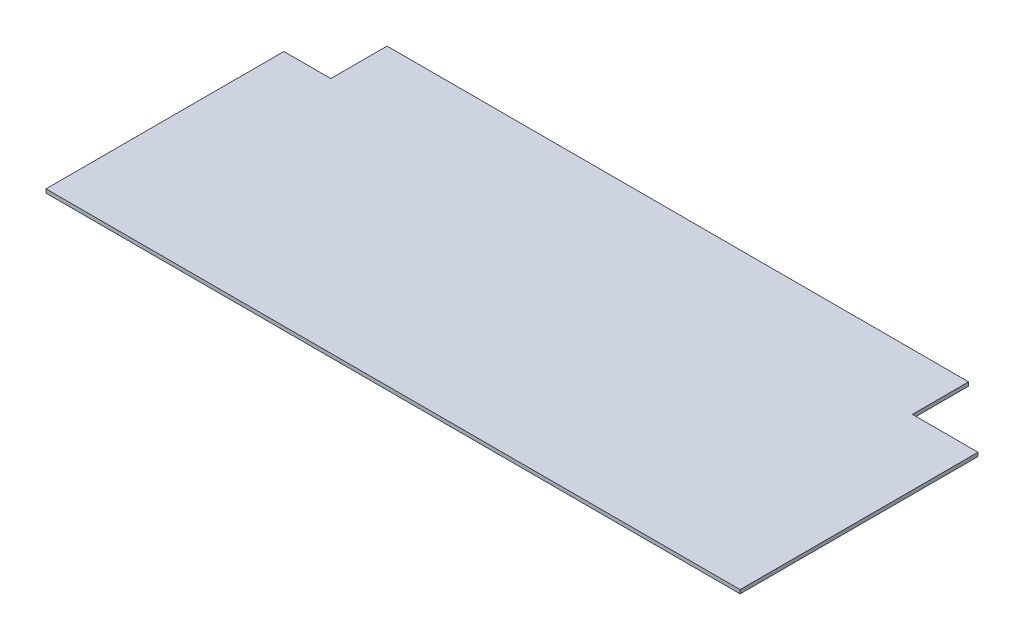
ISO-10303-21;
HEADER;
FILE_DESCRIPTION(('STEP AP214'),'2;1');
FILE_NAME('part.step','',(''),(''),'','','');
FILE_SCHEMA(('AUTOMOTIVE_DESIGN { 1 0 10303 214 1 1 1 1 }'));
ENDSEC;
DATA;
#1=APPLICATION_CONTEXT('core data for automotive mechanical design processes');
#2=APPLICATION_PROTOCOL_DEFINITION('international standard','automotive_design',2000,#1);
#3=PRODUCT_CONTEXT('',#1,'mechanical');
#4=PRODUCT('Part','Part','',(#3));
#5=PRODUCT_RELATED_PRODUCT_CATEGORY('part','',(#4));
#6=PRODUCT_DEFINITION_FORMATION('','',#4);
#7=PRODUCT_DEFINITION_CONTEXT('part definition',#1,'design');
#8=PRODUCT_DEFINITION('design','',#6,#7);
#9=PRODUCT_DEFINITION_SHAPE('','',#8);
#10=(LENGTH_UNIT() NAMED_UNIT(*) SI_UNIT(.MILLI.,.METRE.));
#11=(NAMED_UNIT(*) PLANE_ANGLE_UNIT() SI_UNIT($,.RADIAN.));
#12=(NAMED_UNIT(*) SI_UNIT($,.STERADIAN.) SOLID_ANGLE_UNIT());
#13=UNCERTAINTY_MEASURE_WITH_UNIT(LENGTH_MEASURE(1.E-05),#10,'distance_accuracy_value','');
#14=(GEOMETRIC_REPRESENTATION_CONTEXT(3) GLOBAL_UNCERTAINTY_ASSIGNED_CONTEXT((#13)) GLOBAL_UNIT_ASSIGNED_CONTEXT((#10,
#11,#12)) REPRESENTATION_CONTEXT('',''));
#15=CARTESIAN_POINT('',(0.,0.,0.));
#16=DIRECTION('',(0.,0.,1.));
#17=DIRECTION('',(1.,0.,0.));
#18=AXIS2_PLACEMENT_3D('',#15,#16,#17);
#19=CARTESIAN_POINT('',(301.178602807518,2.54,0.));
#20=DIRECTION('',(1.,0.,0.));
#21=DIRECTION('',(0.,0.,-1.));
#22=AXIS2_PLACEMENT_3D('',#19,#20,#21);
#23=PLANE('',#22);
#24=DIRECTION('',(0.,0.,1.));
#25=VECTOR('',#24,1.);
#26=CARTESIAN_POINT('',(301.178602807518,0.,0.));
#27=LINE('',#26,#25);
#28=CARTESIAN_POINT('',(301.178602807518,0.,-166.257824305169));
#29=VERTEX_POINT('',#28);
#30=CARTESIAN_POINT('',(301.178602807518,0.,-128.157824305169));
#31=VERTEX_POINT('',#30);
#32=EDGE_CURVE('E133',#29,#31,#27,.T.);
#33=ORIENTED_EDGE('',*,*,#32,.F.);
#34=DIRECTION('',(0.,-1.,0.));
#35=VECTOR('',#34,1.);
#36=CARTESIAN_POINT('',(301.178602807518,2.54,-166.257824305169));
#37=LINE('',#36,#35);
#38=CARTESIAN_POINT('',(301.178602807518,2.54,-166.257824305169));
#39=VERTEX_POINT('',#38);
#40=EDGE_CURVE('E11',#39,#29,#37,.T.);
#41=ORIENTED_EDGE('',*,*,#40,.F.);
#42=DIRECTION('',(0.,0.,1.));
#43=VECTOR('',#42,1.);
#44=CARTESIAN_POINT('',(301.178602807518,2.54,0.));
#45=LINE('',#44,#43);
#46=CARTESIAN_POINT('',(301.178602807518,2.54,-128.157824305169));
#47=VERTEX_POINT('',#46);
#48=EDGE_CURVE('E152',#39,#47,#45,.T.);
#49=ORIENTED_EDGE('',*,*,#48,.T.);
#50=DIRECTION('',(0.,-1.,0.));
#51=VECTOR('',#50,1.);
#52=CARTESIAN_POINT('',(301.178602807518,2.54,-128.157824305169));
#53=LINE('',#52,#51);
#54=EDGE_CURVE('E92',#47,#31,#53,.T.);
#55=ORIENTED_EDGE('',*,*,#54,.T.);
#56=EDGE_LOOP('',(#33,#41,#49,#55));
#57=FACE_BOUND('',#56,.T.);
#58=ADVANCED_FACE('F41',(#57),#23,.T.);
#59=CARTESIAN_POINT('',(0.,2.54,-166.257824305169));
#60=DIRECTION('',(0.,0.,-1.));
#61=DIRECTION('',(-1.,0.,0.));
#62=AXIS2_PLACEMENT_3D('',#59,#60,#61);
#63=PLANE('',#62);
#64=DIRECTION('',(1.,0.,0.));
#65=VECTOR('',#64,1.);
#66=CARTESIAN_POINT('',(0.,0.,-166.257824305169));
#67=LINE('',#66,#65);
#68=CARTESIAN_POINT('',(-92.5227972404832,0.,-166.257824305169));
#69=VERTEX_POINT('',#68);
#70=EDGE_CURVE('E136',#69,#29,#67,.T.);
#71=ORIENTED_EDGE('',*,*,#70,.F.);
#72=DIRECTION('',(0.,-1.,0.));
#73=VECTOR('',#72,1.);
#74=CARTESIAN_POINT('',(-92.5227972404832,2.54,-166.257824305169));
#75=LINE('',#74,#73);
#76=CARTESIAN_POINT('',(-92.5227972404832,2.54,-166.257824305169));
#77=VERTEX_POINT('',#76);
#78=EDGE_CURVE('E49',#77,#69,#75,.T.);
#79=ORIENTED_EDGE('',*,*,#78,.F.);
#80=DIRECTION('',(1.,0.,0.));
#81=VECTOR('',#80,1.);
#82=CARTESIAN_POINT('',(0.,2.54,-166.257824305169));
#83=LINE('',#82,#81);
#84=EDGE_CURVE('E173',#77,#39,#83,.T.);
#85=ORIENTED_EDGE('',*,*,#84,.T.);
#86=ORIENTED_EDGE('',*,*,#40,.T.);
#87=EDGE_LOOP('',(#71,#79,#85,#86));
#88=FACE_BOUND('',#87,.T.);
#89=ADVANCED_FACE('F172',(#88),#63,.T.);
#90=CARTESIAN_POINT('',(-92.5227972404832,2.54,0.));
#91=DIRECTION('',(1.,0.,0.));
#92=DIRECTION('',(0.,0.,-1.));
#93=AXIS2_PLACEMENT_3D('',#90,#91,#92);
#94=PLANE('',#93);
#95=DIRECTION('',(0.,0.,1.));
#96=VECTOR('',#95,1.);
#97=CARTESIAN_POINT('',(-92.5227972404832,0.,0.));
#98=LINE('',#97,#96);
#99=CARTESIAN_POINT('',(-92.5227972404832,0.,-128.157824305169));
#100=VERTEX_POINT('',#99);
#101=EDGE_CURVE('E139',#69,#100,#98,.T.);
#102=ORIENTED_EDGE('',*,*,#101,.T.);
#103=DIRECTION('',(0.,-1.,0.));
#104=VECTOR('',#103,1.);
#105=CARTESIAN_POINT('',(-92.5227972404832,2.54,-128.157824305169));
#106=LINE('',#105,#104);
#107=CARTESIAN_POINT('',(-92.5227972404832,2.54,-128.157824305169));
#108=VERTEX_POINT('',#107);
#109=EDGE_CURVE('E158',#108,#100,#106,.T.);
#110=ORIENTED_EDGE('',*,*,#109,.F.);
#111=DIRECTION('',(0.,0.,1.));
#112=VECTOR('',#111,1.);
#113=CARTESIAN_POINT('',(-92.5227972404832,2.54,0.));
#114=LINE('',#113,#112);
#115=EDGE_CURVE('E164',#77,#108,#114,.T.);
#116=ORIENTED_EDGE('',*,*,#115,.F.);
#117=ORIENTED_EDGE('',*,*,#78,.T.);
#118=EDGE_LOOP('',(#102,#110,#116,#117));
#119=FACE_BOUND('',#118,.T.);
#120=ADVANCED_FACE('F162',(#119),#94,.F.);
#121=CARTESIAN_POINT('',(-1.12034462464145E-13,2.54,-128.157824305169));
#122=DIRECTION('',(0.,0.,-1.));
#123=DIRECTION('',(-1.,0.,0.));
#124=AXIS2_PLACEMENT_3D('',#121,#122,#123);
#125=PLANE('',#124);
#126=DIRECTION('',(1.,0.,0.));
#127=VECTOR('',#126,1.);
#128=CARTESIAN_POINT('',(-1.12034462464145E-13,0.,-128.157824305169));
#129=LINE('',#128,#127);
#130=CARTESIAN_POINT('',(-124.272797240483,0.,-128.157824305169));
#131=VERTEX_POINT('',#130);
#132=EDGE_CURVE('E142',#131,#100,#129,.T.);
#133=ORIENTED_EDGE('',*,*,#132,.F.);
#134=DIRECTION('',(0.,-1.,0.));
#135=VECTOR('',#134,1.);
#136=CARTESIAN_POINT('',(-124.272797240483,2.54,-128.157824305169));
#137=LINE('',#136,#135);
#138=CARTESIAN_POINT('',(-124.272797240483,2.54,-128.157824305169));
#139=VERTEX_POINT('',#138);
#140=EDGE_CURVE('E156',#139,#131,#137,.T.);
#141=ORIENTED_EDGE('',*,*,#140,.F.);
#142=DIRECTION('',(1.,0.,0.));
#143=VECTOR('',#142,1.);
#144=CARTESIAN_POINT('',(-1.12034462464145E-13,2.54,-128.157824305169));
#145=LINE('',#144,#143);
#146=EDGE_CURVE('E181',#139,#108,#145,.T.);
#147=ORIENTED_EDGE('',*,*,#146,.T.);
#148=ORIENTED_EDGE('',*,*,#109,.T.);
#149=EDGE_LOOP('',(#133,#141,#147,#148));
#150=FACE_BOUND('',#149,.T.);
#151=ADVANCED_FACE('F187',(#150),#125,.T.);
#152=CARTESIAN_POINT('',(-124.272797240483,2.54,0.));
#153=DIRECTION('',(-1.,0.,0.));
#154=DIRECTION('',(0.,0.,1.));
#155=AXIS2_PLACEMENT_3D('',#152,#153,#154);
#156=PLANE('',#155);
#157=DIRECTION('',(0.,0.,-1.));
#158=VECTOR('',#157,1.);
#159=CARTESIAN_POINT('',(-124.272797240483,0.,0.));
#160=LINE('',#159,#158);
#161=CARTESIAN_POINT('',(-124.272797240483,0.,32.8781756948341));
#162=VERTEX_POINT('',#161);
#163=EDGE_CURVE('E145',#162,#131,#160,.T.);
#164=ORIENTED_EDGE('',*,*,#163,.F.);
#165=DIRECTION('',(0.,-1.,0.));
#166=VECTOR('',#165,1.);
#167=CARTESIAN_POINT('',(-124.272797240483,2.54,32.8781756948341));
#168=LINE('',#167,#166);
#169=CARTESIAN_POINT('',(-124.272797240483,2.54,32.8781756948341));
#170=VERTEX_POINT('',#169);
#171=EDGE_CURVE('E125',#170,#162,#168,.T.);
#172=ORIENTED_EDGE('',*,*,#171,.F.);
#173=DIRECTION('',(0.,0.,-1.));
#174=VECTOR('',#173,1.);
#175=CARTESIAN_POINT('',(-124.272797240483,2.54,0.));
#176=LINE('',#175,#174);
#177=EDGE_CURVE('E118',#170,#139,#176,.T.);
#178=ORIENTED_EDGE('',*,*,#177,.T.);
#179=ORIENTED_EDGE('',*,*,#140,.T.);
#180=EDGE_LOOP('',(#164,#172,#178,#179));
#181=FACE_BOUND('',#180,.T.);
#182=ADVANCED_FACE('F185',(#181),#156,.T.);
#183=CARTESIAN_POINT('',(0.,2.54,32.8781756948341));
#184=DIRECTION('',(0.,0.,-1.));
#185=DIRECTION('',(-1.,0.,0.));
#186=AXIS2_PLACEMENT_3D('',#183,#184,#185);
#187=PLANE('',#186);
#188=DIRECTION('',(1.,0.,0.));
#189=VECTOR('',#188,1.);
#190=CARTESIAN_POINT('',(0.,0.,32.8781756948341));
#191=LINE('',#190,#189);
#192=CARTESIAN_POINT('',(345.628602807518,0.,32.8781756948341));
#193=VERTEX_POINT('',#192);
#194=EDGE_CURVE('E124',#162,#193,#191,.T.);
#195=ORIENTED_EDGE('',*,*,#194,.T.);
#196=DIRECTION('',(0.,-1.,0.));
#197=VECTOR('',#196,1.);
#198=CARTESIAN_POINT('',(345.628602807518,2.54,32.8781756948341));
#199=LINE('',#198,#197);
#200=CARTESIAN_POINT('',(345.628602807518,2.54,32.8781756948341));
#201=VERTEX_POINT('',#200);
#202=EDGE_CURVE('E121',#201,#193,#199,.T.);
#203=ORIENTED_EDGE('',*,*,#202,.F.);
#204=DIRECTION('',(1.,0.,0.));
#205=VECTOR('',#204,1.);
#206=CARTESIAN_POINT('',(0.,2.54,32.8781756948341));
#207=LINE('',#206,#205);
#208=EDGE_CURVE('E111',#170,#201,#207,.T.);
#209=ORIENTED_EDGE('',*,*,#208,.F.);
#210=ORIENTED_EDGE('',*,*,#171,.T.);
#211=EDGE_LOOP('',(#195,#203,#209,#210));
#212=FACE_BOUND('',#211,.T.);
#213=ADVANCED_FACE('F122',(#212),#187,.F.);
#214=CARTESIAN_POINT('',(345.628602807518,2.54,0.));
#215=DIRECTION('',(-1.,0.,0.));
#216=DIRECTION('',(0.,0.,1.));
#217=AXIS2_PLACEMENT_3D('',#214,#215,#216);
#218=PLANE('',#217);
#219=DIRECTION('',(0.,0.,-1.));
#220=VECTOR('',#219,1.);
#221=CARTESIAN_POINT('',(345.628602807518,0.,0.));
#222=LINE('',#221,#220);
#223=CARTESIAN_POINT('',(345.628602807518,0.,-128.157824305169));
#224=VERTEX_POINT('',#223);
#225=EDGE_CURVE('E85',#193,#224,#222,.T.);
#226=ORIENTED_EDGE('',*,*,#225,.T.);
#227=DIRECTION('',(0.,-1.,0.));
#228=VECTOR('',#227,1.);
#229=CARTESIAN_POINT('',(345.628602807518,2.54,-128.157824305169));
#230=LINE('',#229,#228);
#231=CARTESIAN_POINT('',(345.628602807518,2.54,-128.157824305169));
#232=VERTEX_POINT('',#231);
#233=EDGE_CURVE('E126',#232,#224,#230,.T.);
#234=ORIENTED_EDGE('',*,*,#233,.F.);
#235=DIRECTION('',(0.,0.,-1.));
#236=VECTOR('',#235,1.);
#237=CARTESIAN_POINT('',(345.628602807518,2.54,0.));
#238=LINE('',#237,#236);
#239=EDGE_CURVE('E115',#201,#232,#238,.T.);
#240=ORIENTED_EDGE('',*,*,#239,.F.);
#241=ORIENTED_EDGE('',*,*,#202,.T.);
#242=EDGE_LOOP('',(#226,#234,#240,#241));
#243=FACE_BOUND('',#242,.T.);
#244=ADVANCED_FACE('F128',(#243),#218,.F.);
#245=CARTESIAN_POINT('',(0.,2.54,-128.157824305169));
#246=DIRECTION('',(0.,0.,1.));
#247=DIRECTION('',(1.,0.,0.));
#248=AXIS2_PLACEMENT_3D('',#245,#246,#247);
#249=PLANE('',#248);
#250=DIRECTION('',(-1.,0.,0.));
#251=VECTOR('',#250,1.);
#252=CARTESIAN_POINT('',(0.,0.,-128.157824305169));
#253=LINE('',#252,#251);
#254=EDGE_CURVE('E150',#224,#31,#253,.T.);
#255=ORIENTED_EDGE('',*,*,#254,.T.);
#256=ORIENTED_EDGE('',*,*,#54,.F.);
#257=DIRECTION('',(-1.,0.,0.));
#258=VECTOR('',#257,1.);
#259=CARTESIAN_POINT('',(0.,2.54,-128.157824305169));
#260=LINE('',#259,#258);
#261=EDGE_CURVE('E57',#232,#47,#260,.T.);
#262=ORIENTED_EDGE('',*,*,#261,.F.);
#263=ORIENTED_EDGE('',*,*,#233,.T.);
#264=EDGE_LOOP('',(#255,#256,#262,#263));
#265=FACE_BOUND('',#264,.T.);
#266=ADVANCED_FACE('F176',(#265),#249,.F.);
#267=CARTESIAN_POINT('',(0.,2.54,0.));
#268=DIRECTION('',(0.,1.,0.));
#269=DIRECTION('',(0.,0.,1.));
#270=AXIS2_PLACEMENT_3D('',#267,#268,#269);
#271=PLANE('',#270);
#272=ORIENTED_EDGE('',*,*,#48,.F.);
#273=ORIENTED_EDGE('',*,*,#84,.F.);
#274=ORIENTED_EDGE('',*,*,#115,.T.);
#275=ORIENTED_EDGE('',*,*,#146,.F.);
#276=ORIENTED_EDGE('',*,*,#177,.F.);
#277=ORIENTED_EDGE('',*,*,#208,.T.);
#278=ORIENTED_EDGE('',*,*,#239,.T.);
#279=ORIENTED_EDGE('',*,*,#261,.T.);
#280=EDGE_LOOP('',(#272,#273,#274,#275,#276,#277,#278,#279));
#281=FACE_BOUND('',#280,.T.);
#282=ADVANCED_FACE('F113',(#281),#271,.T.);
#283=CARTESIAN_POINT('',(0.,0.,0.));
#284=DIRECTION('',(0.,1.,0.));
#285=DIRECTION('',(0.,0.,1.));
#286=AXIS2_PLACEMENT_3D('',#283,#284,#285);
#287=PLANE('',#286);
#288=ORIENTED_EDGE('',*,*,#32,.T.);
#289=ORIENTED_EDGE('',*,*,#254,.F.);
#290=ORIENTED_EDGE('',*,*,#225,.F.);
#291=ORIENTED_EDGE('',*,*,#194,.F.);
#292=ORIENTED_EDGE('',*,*,#163,.T.);
#293=ORIENTED_EDGE('',*,*,#132,.T.);
#294=ORIENTED_EDGE('',*,*,#101,.F.);
#295=ORIENTED_EDGE('',*,*,#70,.T.);
#296=EDGE_LOOP('',(#288,#289,#290,#291,#292,#293,#294,#295));
#297=FACE_BOUND('',#296,.T.);
#298=ADVANCED_FACE('F170',(#297),#287,.F.);
#299=CLOSED_SHELL('',(#58,#89,#120,#151,#182,#213,#244,#266,#282,#298));
#300=MANIFOLD_SOLID_BREP('B2',#299);
#301=ADVANCED_BREP_SHAPE_REPRESENTATION('',(#18,#300),#14);
#302=SHAPE_DEFINITION_REPRESENTATION(#9,#301);
ENDSEC;
END-ISO-10303-21;
